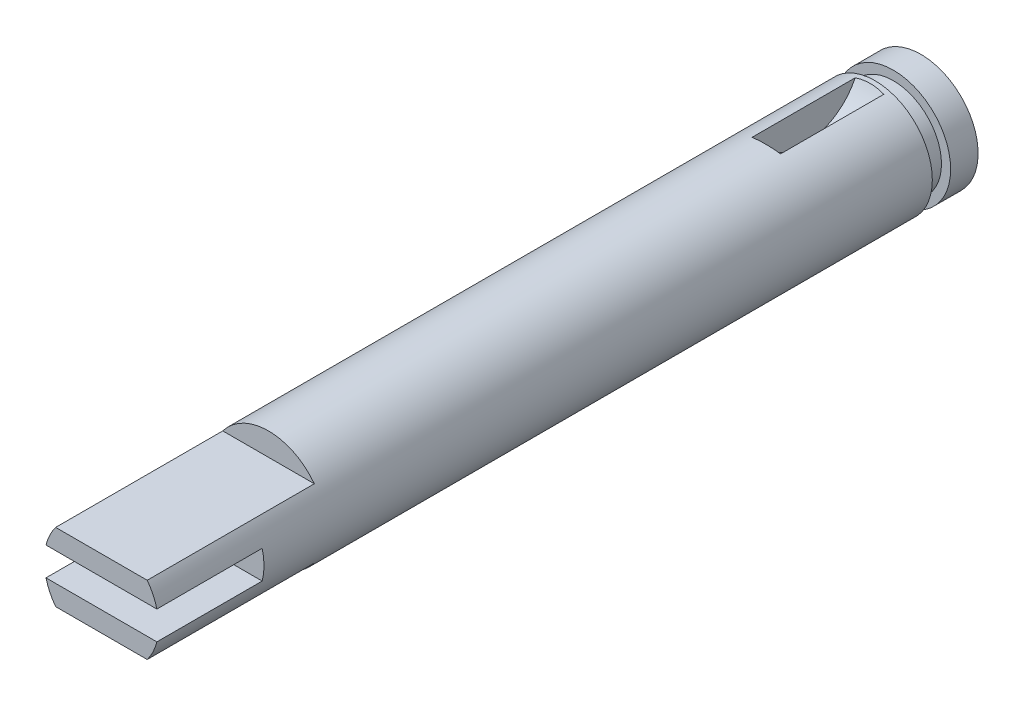
ISO-10303-21;
HEADER;
FILE_DESCRIPTION(('STEP AP214'),'2;1');
FILE_NAME('part.step','',(''),(''),'','','');
FILE_SCHEMA(('AUTOMOTIVE_DESIGN { 1 0 10303 214 1 1 1 1 }'));
ENDSEC;
DATA;
#1=APPLICATION_CONTEXT('core data for automotive mechanical design processes');
#2=APPLICATION_PROTOCOL_DEFINITION('international standard','automotive_design',2000,#1);
#3=PRODUCT_CONTEXT('',#1,'mechanical');
#4=PRODUCT('Part','Part','',(#3));
#5=PRODUCT_RELATED_PRODUCT_CATEGORY('part','',(#4));
#6=PRODUCT_DEFINITION_FORMATION('','',#4);
#7=PRODUCT_DEFINITION_CONTEXT('part definition',#1,'design');
#8=PRODUCT_DEFINITION('design','',#6,#7);
#9=PRODUCT_DEFINITION_SHAPE('','',#8);
#10=(LENGTH_UNIT() NAMED_UNIT(*) SI_UNIT(.MILLI.,.METRE.));
#11=(NAMED_UNIT(*) PLANE_ANGLE_UNIT() SI_UNIT($,.RADIAN.));
#12=(NAMED_UNIT(*) SI_UNIT($,.STERADIAN.) SOLID_ANGLE_UNIT());
#13=UNCERTAINTY_MEASURE_WITH_UNIT(LENGTH_MEASURE(1.E-05),#10,'distance_accuracy_value','');
#14=(GEOMETRIC_REPRESENTATION_CONTEXT(3) GLOBAL_UNCERTAINTY_ASSIGNED_CONTEXT((#13)) GLOBAL_UNIT_ASSIGNED_CONTEXT((#10,
#11,#12)) REPRESENTATION_CONTEXT('',''));
#15=CARTESIAN_POINT('',(0.,0.,0.));
#16=DIRECTION('',(0.,0.,1.));
#17=DIRECTION('',(1.,0.,0.));
#18=AXIS2_PLACEMENT_3D('',#15,#16,#17);
#19=CARTESIAN_POINT('',(0.,0.,42.926));
#20=DIRECTION('',(0.,0.,1.));
#21=DIRECTION('',(1.,0.,0.));
#22=AXIS2_PLACEMENT_3D('',#19,#20,#21);
#23=PLANE('',#22);
#24=CARTESIAN_POINT('',(0.,0.,42.926));
#25=DIRECTION('',(0.,0.,1.));
#26=DIRECTION('',(1.,0.,0.));
#27=AXIS2_PLACEMENT_3D('',#24,#25,#26);
#28=CIRCLE('',#27,3.175);
#29=CARTESIAN_POINT('',(-3.07581310225443,-0.7874,42.926));
#30=VERTEX_POINT('',#29);
#31=CARTESIAN_POINT('',(-2.54,-1.905,42.926));
#32=VERTEX_POINT('',#31);
#33=EDGE_CURVE('E161',#30,#32,#28,.T.);
#34=ORIENTED_EDGE('',*,*,#33,.T.);
#35=DIRECTION('',(1.,0.,0.));
#36=VECTOR('',#35,1.);
#37=CARTESIAN_POINT('',(-3.175,-1.905,42.926));
#38=LINE('',#37,#36);
#39=CARTESIAN_POINT('',(2.54,-1.905,42.926));
#40=VERTEX_POINT('',#39);
#41=EDGE_CURVE('E125',#32,#40,#38,.T.);
#42=ORIENTED_EDGE('',*,*,#41,.T.);
#43=CARTESIAN_POINT('',(3.07581310225443,-0.7874,42.926));
#44=VERTEX_POINT('',#43);
#45=EDGE_CURVE('E58',#40,#44,#28,.T.);
#46=ORIENTED_EDGE('',*,*,#45,.T.);
#47=DIRECTION('',(1.,0.,0.));
#48=VECTOR('',#47,1.);
#49=CARTESIAN_POINT('',(-3.175,-0.7874,42.926));
#50=LINE('',#49,#48);
#51=EDGE_CURVE('E133',#30,#44,#50,.T.);
#52=ORIENTED_EDGE('',*,*,#51,.F.);
#53=EDGE_LOOP('',(#34,#42,#46,#52));
#54=FACE_BOUND('',#53,.T.);
#55=ADVANCED_FACE('F34',(#54),#23,.T.);
#56=CARTESIAN_POINT('',(0.,0.,42.926));
#57=DIRECTION('',(0.,0.,-1.));
#58=DIRECTION('',(-1.,0.,0.));
#59=AXIS2_PLACEMENT_3D('',#56,#57,#58);
#60=CYLINDRICAL_SURFACE('',#59,3.175);
#61=CARTESIAN_POINT('',(0.,0.,0.));
#62=DIRECTION('',(0.,0.,1.));
#63=DIRECTION('',(1.,0.,0.));
#64=AXIS2_PLACEMENT_3D('',#61,#62,#63);
#65=CIRCLE('',#64,3.175);
#66=CARTESIAN_POINT('',(3.175,0.,0.));
#67=VERTEX_POINT('',#66);
#68=EDGE_CURVE('E149',#67,#67,#65,.T.);
#69=ORIENTED_EDGE('',*,*,#68,.T.);
#70=EDGE_LOOP('',(#69));
#71=FACE_BOUND('',#70,.T.);
#72=CARTESIAN_POINT('',(0.79375,3.07418053105214,0.31117755725787));
#73=CARTESIAN_POINT('',(0.714888608920865,3.09455662843597,0.301450554495417));
#74=CARTESIAN_POINT('',(0.63505416141262,3.11191895979803,0.293381371889491));
#75=CARTESIAN_POINT('',(0.474031104442736,3.14047497122854,0.280327929345211));
#76=CARTESIAN_POINT('',(0.392842353277951,3.15166800156809,0.275343994327388));
#77=CARTESIAN_POINT('',(0.231571379542788,3.16755748116306,0.268313017791284));
#78=CARTESIAN_POINT('',(0.151505888276026,3.17239566707134,0.266201862514545));
#79=CARTESIAN_POINT('',(-0.00875508518506204,3.17599957954489,0.264627640077035));
#80=CARTESIAN_POINT('',(-0.0889505252156203,3.17476698826052,0.265163839361458));
#81=CARTESIAN_POINT('',(-0.273819967836502,3.16491035844165,0.269480487372106));
#82=CARTESIAN_POINT('',(-0.378370536384788,3.1541121097031,0.274215701820489));
#83=CARTESIAN_POINT('',(-0.534502897532229,3.13013870504281,0.285045446695591));
#84=CARTESIAN_POINT('',(-0.586827990033408,3.12074930541512,0.289323834308464));
#85=CARTESIAN_POINT('',(-0.690818751526154,3.09938886056079,0.299223415951192));
#86=CARTESIAN_POINT('',(-0.742484433325476,3.08741786555765,0.304844583858243));
#87=CARTESIAN_POINT('',(-0.79375,3.07418053105214,0.31117755725787));
#88=B_SPLINE_CURVE_WITH_KNOTS('',3,(#72,#73,#74,#75,#76,#77,#78,#79,#80,#81,#82,#83,#84,#85,#86,
#87),.UNSPECIFIED.,.F.,.F.,(4,2,2,2,2,2,2,4),(0.,0.245998689057966,0.492023280877516,
0.732461803114019,0.972833706040775,1.28776854451322,1.44769609311939,1.60762053070593),.UNSPECIFIED.);
#89=CARTESIAN_POINT('',(0.79375,3.07418053105214,0.31117755725787));
#90=VERTEX_POINT('',#89);
#91=CARTESIAN_POINT('',(-0.79375,3.07418053105214,0.31117755725787));
#92=VERTEX_POINT('',#91);
#93=EDGE_CURVE('E173',#90,#92,#88,.T.);
#94=ORIENTED_EDGE('',*,*,#93,.F.);
#95=DIRECTION('',(0.,0.,-1.));
#96=VECTOR('',#95,1.);
#97=CARTESIAN_POINT('',(0.79375,3.07418053105214,42.926));
#98=LINE('',#97,#96);
#99=CARTESIAN_POINT('',(0.79375,3.07418053105214,6.03882244274213));
#100=VERTEX_POINT('',#99);
#101=EDGE_CURVE('E233',#90,#100,#98,.F.);
#102=ORIENTED_EDGE('',*,*,#101,.T.);
#103=CARTESIAN_POINT('',(-0.79375,3.07418053105214,6.03882244274213));
#104=CARTESIAN_POINT('',(-0.714888608920865,3.09455662843597,6.04854944550458));
#105=CARTESIAN_POINT('',(-0.63505416141262,3.11191895979803,6.05661862811051));
#106=CARTESIAN_POINT('',(-0.474031104442736,3.14047497122854,6.06967207065479));
#107=CARTESIAN_POINT('',(-0.392842353277951,3.15166800156809,6.07465600567261));
#108=CARTESIAN_POINT('',(-0.231571379542789,3.16755748116306,6.08168698220872));
#109=CARTESIAN_POINT('',(-0.151505888276026,3.17239566707134,6.08379813748545));
#110=CARTESIAN_POINT('',(0.0087550851850621,3.17599957954489,6.08537235992296));
#111=CARTESIAN_POINT('',(0.0889505252156204,3.17476698826052,6.08483616063854));
#112=CARTESIAN_POINT('',(0.273819967836502,3.16491035844165,6.08051951262789));
#113=CARTESIAN_POINT('',(0.378370536384788,3.1541121097031,6.07578429817951));
#114=CARTESIAN_POINT('',(0.534502897532229,3.13013870504281,6.06495455330441));
#115=CARTESIAN_POINT('',(0.586827990033408,3.12074930541512,6.06067616569154));
#116=CARTESIAN_POINT('',(0.690818751526154,3.09938886056079,6.05077658404881));
#117=CARTESIAN_POINT('',(0.742484433325476,3.08741786555765,6.04515541614176));
#118=CARTESIAN_POINT('',(0.79375,3.07418053105214,6.03882244274213));
#119=B_SPLINE_CURVE_WITH_KNOTS('',3,(#103,#104,#105,#106,#107,#108,#109,#110,#111,#112,#113,
#114,#115,#116,#117,#118),.UNSPECIFIED.,.F.,.F.,(4,2,2,2,2,2,2,4),(0.,0.245998689057966,
0.492023280877517,0.732461803114019,0.972833706040776,1.28776854451322,1.44769609311939,
1.60762053070593),.UNSPECIFIED.);
#120=CARTESIAN_POINT('',(-0.79375,3.07418053105214,6.03882244274213));
#121=VERTEX_POINT('',#120);
#122=EDGE_CURVE('E167',#121,#100,#119,.T.);
#123=ORIENTED_EDGE('',*,*,#122,.F.);
#124=DIRECTION('',(0.,0.,-1.));
#125=VECTOR('',#124,1.);
#126=CARTESIAN_POINT('',(-0.79375,3.07418053105214,42.926));
#127=LINE('',#126,#125);
#128=EDGE_CURVE('E165',#92,#121,#127,.F.);
#129=ORIENTED_EDGE('',*,*,#128,.F.);
#130=EDGE_LOOP('',(#94,#102,#123,#129));
#131=FACE_BOUND('',#130,.T.);
#132=DIRECTION('',(0.,0.,-1.));
#133=VECTOR('',#132,1.);
#134=CARTESIAN_POINT('',(-2.54,-1.905,42.926));
#135=LINE('',#134,#133);
#136=CARTESIAN_POINT('',(-2.54,-1.905,33.655));
#137=VERTEX_POINT('',#136);
#138=EDGE_CURVE('E12',#32,#137,#135,.T.);
#139=ORIENTED_EDGE('',*,*,#138,.F.);
#140=ORIENTED_EDGE('',*,*,#33,.F.);
#141=DIRECTION('',(0.,0.,-1.));
#142=VECTOR('',#141,1.);
#143=CARTESIAN_POINT('',(-3.07581310225443,-0.7874,42.926));
#144=LINE('',#143,#142);
#145=CARTESIAN_POINT('',(-3.07581310225443,-0.787399999999999,37.084));
#146=VERTEX_POINT('',#145);
#147=EDGE_CURVE('E220',#30,#146,#144,.T.);
#148=ORIENTED_EDGE('',*,*,#147,.T.);
#149=CARTESIAN_POINT('',(0.,0.,37.084));
#150=DIRECTION('',(0.,0.,-1.));
#151=DIRECTION('',(-1.,0.,0.));
#152=AXIS2_PLACEMENT_3D('',#149,#150,#151);
#153=CIRCLE('',#152,3.175);
#154=CARTESIAN_POINT('',(-3.07581310225443,0.787400000000001,37.084));
#155=VERTEX_POINT('',#154);
#156=EDGE_CURVE('E211',#146,#155,#153,.T.);
#157=ORIENTED_EDGE('',*,*,#156,.T.);
#158=DIRECTION('',(0.,0.,-1.));
#159=VECTOR('',#158,1.);
#160=CARTESIAN_POINT('',(-3.07581310225443,0.7874,42.926));
#161=LINE('',#160,#159);
#162=CARTESIAN_POINT('',(-3.07581310225443,0.7874,42.926));
#163=VERTEX_POINT('',#162);
#164=EDGE_CURVE('E209',#155,#163,#161,.F.);
#165=ORIENTED_EDGE('',*,*,#164,.T.);
#166=CARTESIAN_POINT('',(-2.54,1.905,42.926));
#167=VERTEX_POINT('',#166);
#168=EDGE_CURVE('E163',#167,#163,#28,.T.);
#169=ORIENTED_EDGE('',*,*,#168,.F.);
#170=DIRECTION('',(0.,0.,-1.));
#171=VECTOR('',#170,1.);
#172=CARTESIAN_POINT('',(-2.54,1.905,42.926));
#173=LINE('',#172,#171);
#174=CARTESIAN_POINT('',(-2.54,1.905,33.655));
#175=VERTEX_POINT('',#174);
#176=EDGE_CURVE('E120',#167,#175,#173,.T.);
#177=ORIENTED_EDGE('',*,*,#176,.T.);
#178=CARTESIAN_POINT('',(0.,0.,33.655));
#179=DIRECTION('',(0.,0.,-1.));
#180=DIRECTION('',(-1.,0.,0.));
#181=AXIS2_PLACEMENT_3D('',#178,#179,#180);
#182=CIRCLE('',#181,3.175);
#183=CARTESIAN_POINT('',(2.54,1.905,33.655));
#184=VERTEX_POINT('',#183);
#185=EDGE_CURVE('E217',#175,#184,#182,.T.);
#186=ORIENTED_EDGE('',*,*,#185,.T.);
#187=DIRECTION('',(0.,0.,-1.));
#188=VECTOR('',#187,1.);
#189=CARTESIAN_POINT('',(2.54,1.905,42.926));
#190=LINE('',#189,#188);
#191=CARTESIAN_POINT('',(2.54,1.905,42.926));
#192=VERTEX_POINT('',#191);
#193=EDGE_CURVE('E214',#184,#192,#190,.F.);
#194=ORIENTED_EDGE('',*,*,#193,.T.);
#195=CARTESIAN_POINT('',(3.07581310225443,0.7874,42.926));
#196=VERTEX_POINT('',#195);
#197=EDGE_CURVE('E164',#196,#192,#28,.T.);
#198=ORIENTED_EDGE('',*,*,#197,.F.);
#199=DIRECTION('',(0.,0.,-1.));
#200=VECTOR('',#199,1.);
#201=CARTESIAN_POINT('',(3.07581310225443,0.7874,42.926));
#202=LINE('',#201,#200);
#203=CARTESIAN_POINT('',(3.07581310225443,0.787400000000001,37.084));
#204=VERTEX_POINT('',#203);
#205=EDGE_CURVE('E215',#196,#204,#202,.T.);
#206=ORIENTED_EDGE('',*,*,#205,.T.);
#207=CARTESIAN_POINT('',(3.07581310225443,-0.787399999999999,37.084));
#208=VERTEX_POINT('',#207);
#209=EDGE_CURVE('E228',#204,#208,#153,.T.);
#210=ORIENTED_EDGE('',*,*,#209,.T.);
#211=DIRECTION('',(0.,0.,-1.));
#212=VECTOR('',#211,1.);
#213=CARTESIAN_POINT('',(3.07581310225443,-0.7874,42.926));
#214=LINE('',#213,#212);
#215=EDGE_CURVE('E227',#208,#44,#214,.F.);
#216=ORIENTED_EDGE('',*,*,#215,.T.);
#217=ORIENTED_EDGE('',*,*,#45,.F.);
#218=DIRECTION('',(0.,0.,-1.));
#219=VECTOR('',#218,1.);
#220=CARTESIAN_POINT('',(2.54,-1.905,42.926));
#221=LINE('',#220,#219);
#222=CARTESIAN_POINT('',(2.54,-1.905,33.655));
#223=VERTEX_POINT('',#222);
#224=EDGE_CURVE('E43',#223,#40,#221,.F.);
#225=ORIENTED_EDGE('',*,*,#224,.F.);
#226=CARTESIAN_POINT('',(0.,0.,33.655));
#227=DIRECTION('',(0.,0.,1.));
#228=DIRECTION('',(1.,0.,0.));
#229=AXIS2_PLACEMENT_3D('',#226,#227,#228);
#230=CIRCLE('',#229,3.175);
#231=EDGE_CURVE('E114',#137,#223,#230,.T.);
#232=ORIENTED_EDGE('',*,*,#231,.F.);
#233=EDGE_LOOP('',(#139,#140,#148,#157,#165,#169,#177,#186,#194,#198,#206,#210,#216,#217,#225,#232));
#234=FACE_BOUND('',#233,.T.);
#235=ADVANCED_FACE('F36',(#71,#131,#234),#60,.T.);
#236=DIRECTION('',(1.,0.,0.));
#237=VECTOR('',#236,1.);
#238=CARTESIAN_POINT('',(-3.175,1.905,42.926));
#239=LINE('',#238,#237);
#240=EDGE_CURVE('E50',#167,#192,#239,.T.);
#241=ORIENTED_EDGE('',*,*,#240,.F.);
#242=ORIENTED_EDGE('',*,*,#168,.T.);
#243=DIRECTION('',(1.,0.,0.));
#244=VECTOR('',#243,1.);
#245=CARTESIAN_POINT('',(-3.175,0.7874,42.926));
#246=LINE('',#245,#244);
#247=EDGE_CURVE('E135',#163,#196,#246,.T.);
#248=ORIENTED_EDGE('',*,*,#247,.T.);
#249=ORIENTED_EDGE('',*,*,#197,.T.);
#250=EDGE_LOOP('',(#241,#242,#248,#249));
#251=FACE_BOUND('',#250,.T.);
#252=ADVANCED_FACE('F188',(#251),#23,.T.);
#253=CARTESIAN_POINT('',(0.,0.,-2.54));
#254=DIRECTION('',(0.,0.,-1.));
#255=DIRECTION('',(-1.,0.,0.));
#256=AXIS2_PLACEMENT_3D('',#253,#254,#255);
#257=CIRCLE('',#256,3.175);
#258=CARTESIAN_POINT('',(-3.175,0.,-2.54));
#259=VERTEX_POINT('',#258);
#260=EDGE_CURVE('E152',#259,#259,#257,.T.);
#261=ORIENTED_EDGE('',*,*,#260,.F.);
#262=EDGE_LOOP('',(#261));
#263=FACE_BOUND('',#262,.T.);
#264=CARTESIAN_POINT('',(0.,0.,-1.016));
#265=DIRECTION('',(0.,0.,1.));
#266=DIRECTION('',(1.,0.,0.));
#267=AXIS2_PLACEMENT_3D('',#264,#265,#266);
#268=CIRCLE('',#267,3.175);
#269=CARTESIAN_POINT('',(3.175,0.,-1.016));
#270=VERTEX_POINT('',#269);
#271=EDGE_CURVE('E156',#270,#270,#268,.T.);
#272=ORIENTED_EDGE('',*,*,#271,.F.);
#273=EDGE_LOOP('',(#272));
#274=FACE_BOUND('',#273,.T.);
#275=ADVANCED_FACE('F193',(#263,#274),#60,.T.);
#276=CARTESIAN_POINT('',(0.,0.,-2.54));
#277=DIRECTION('',(0.,0.,-1.));
#278=DIRECTION('',(-1.,0.,0.));
#279=AXIS2_PLACEMENT_3D('',#276,#277,#278);
#280=PLANE('',#279);
#281=ORIENTED_EDGE('',*,*,#260,.T.);
#282=EDGE_LOOP('',(#281));
#283=FACE_BOUND('',#282,.T.);
#284=ADVANCED_FACE('F199',(#283),#280,.T.);
#285=CARTESIAN_POINT('',(0.,0.,-1.016));
#286=DIRECTION('',(0.,0.,1.));
#287=DIRECTION('',(1.,0.,0.));
#288=AXIS2_PLACEMENT_3D('',#285,#286,#287);
#289=PLANE('',#288);
#290=CARTESIAN_POINT('',(0.,0.,-1.016));
#291=DIRECTION('',(0.,0.,1.));
#292=DIRECTION('',(1.,0.,0.));
#293=AXIS2_PLACEMENT_3D('',#290,#291,#292);
#294=CIRCLE('',#293,2.667);
#295=CARTESIAN_POINT('',(2.667,0.,-1.016));
#296=VERTEX_POINT('',#295);
#297=EDGE_CURVE('E146',#296,#296,#294,.T.);
#298=ORIENTED_EDGE('',*,*,#297,.F.);
#299=EDGE_LOOP('',(#298));
#300=FACE_BOUND('',#299,.T.);
#301=ORIENTED_EDGE('',*,*,#271,.T.);
#302=EDGE_LOOP('',(#301));
#303=FACE_BOUND('',#302,.T.);
#304=ADVANCED_FACE('F263',(#300,#303),#289,.T.);
#305=CARTESIAN_POINT('',(0.,0.,0.));
#306=DIRECTION('',(0.,0.,1.));
#307=DIRECTION('',(1.,0.,0.));
#308=AXIS2_PLACEMENT_3D('',#305,#306,#307);
#309=PLANE('',#308);
#310=CARTESIAN_POINT('',(0.,0.,0.));
#311=DIRECTION('',(0.,0.,1.));
#312=DIRECTION('',(1.,0.,0.));
#313=AXIS2_PLACEMENT_3D('',#310,#311,#312);
#314=CIRCLE('',#313,2.667);
#315=CARTESIAN_POINT('',(2.667,0.,0.));
#316=VERTEX_POINT('',#315);
#317=EDGE_CURVE('E138',#316,#316,#314,.T.);
#318=ORIENTED_EDGE('',*,*,#317,.T.);
#319=EDGE_LOOP('',(#318));
#320=FACE_BOUND('',#319,.T.);
#321=ORIENTED_EDGE('',*,*,#68,.F.);
#322=EDGE_LOOP('',(#321));
#323=FACE_BOUND('',#322,.T.);
#324=ADVANCED_FACE('F261',(#320,#323),#309,.F.);
#325=CARTESIAN_POINT('',(0.,0.,-1.016));
#326=DIRECTION('',(0.,0.,1.));
#327=DIRECTION('',(1.,0.,0.));
#328=AXIS2_PLACEMENT_3D('',#325,#326,#327);
#329=CYLINDRICAL_SURFACE('',#328,2.667);
#330=ORIENTED_EDGE('',*,*,#297,.T.);
#331=EDGE_LOOP('',(#330));
#332=FACE_BOUND('',#331,.T.);
#333=ORIENTED_EDGE('',*,*,#317,.F.);
#334=EDGE_LOOP('',(#333));
#335=FACE_BOUND('',#334,.T.);
#336=ADVANCED_FACE('F257',(#332,#335),#329,.T.);
#337=CARTESIAN_POINT('',(-0.79375,4.445,3.175));
#338=DIRECTION('',(1.,0.,0.));
#339=DIRECTION('',(0.,0.,-1.));
#340=AXIS2_PLACEMENT_3D('',#337,#338,#339);
#341=PLANE('',#340);
#342=ORIENTED_EDGE('',*,*,#128,.T.);
#343=CARTESIAN_POINT('',(-0.79375,4.445,3.175));
#344=DIRECTION('',(1.,0.,0.));
#345=DIRECTION('',(0.,0.,-1.));
#346=AXIS2_PLACEMENT_3D('',#343,#344,#345);
#347=CIRCLE('',#346,3.175);
#348=EDGE_CURVE('E155',#121,#92,#347,.T.);
#349=ORIENTED_EDGE('',*,*,#348,.T.);
#350=EDGE_LOOP('',(#342,#349));
#351=FACE_BOUND('',#350,.T.);
#352=ADVANCED_FACE('F260',(#351),#341,.T.);
#353=CARTESIAN_POINT('',(0.79375,4.445,3.175));
#354=DIRECTION('',(1.,0.,0.));
#355=DIRECTION('',(0.,0.,-1.));
#356=AXIS2_PLACEMENT_3D('',#353,#354,#355);
#357=PLANE('',#356);
#358=CARTESIAN_POINT('',(0.79375,4.445,3.175));
#359=DIRECTION('',(1.,0.,0.));
#360=DIRECTION('',(0.,0.,-1.));
#361=AXIS2_PLACEMENT_3D('',#358,#359,#360);
#362=CIRCLE('',#361,3.175);
#363=EDGE_CURVE('E158',#100,#90,#362,.T.);
#364=ORIENTED_EDGE('',*,*,#363,.F.);
#365=ORIENTED_EDGE('',*,*,#101,.F.);
#366=EDGE_LOOP('',(#364,#365));
#367=FACE_BOUND('',#366,.T.);
#368=ADVANCED_FACE('F183',(#367),#357,.F.);
#369=CARTESIAN_POINT('',(0.79375,4.445,3.175));
#370=DIRECTION('',(-1.,0.,0.));
#371=DIRECTION('',(0.,0.,1.));
#372=AXIS2_PLACEMENT_3D('',#369,#370,#371);
#373=CYLINDRICAL_SURFACE('',#372,3.175);
#374=ORIENTED_EDGE('',*,*,#93,.T.);
#375=ORIENTED_EDGE('',*,*,#348,.F.);
#376=ORIENTED_EDGE('',*,*,#122,.T.);
#377=ORIENTED_EDGE('',*,*,#363,.T.);
#378=EDGE_LOOP('',(#374,#375,#376,#377));
#379=FACE_BOUND('',#378,.T.);
#380=ADVANCED_FACE('F178',(#379),#373,.F.);
#381=CARTESIAN_POINT('',(-3.175,0.787400000000001,37.084));
#382=DIRECTION('',(0.,1.,0.));
#383=DIRECTION('',(0.,0.,1.));
#384=AXIS2_PLACEMENT_3D('',#381,#382,#383);
#385=PLANE('',#384);
#386=ORIENTED_EDGE('',*,*,#247,.F.);
#387=ORIENTED_EDGE('',*,*,#164,.F.);
#388=DIRECTION('',(1.,0.,0.));
#389=VECTOR('',#388,1.);
#390=CARTESIAN_POINT('',(-3.175,0.787400000000001,37.084));
#391=LINE('',#390,#389);
#392=EDGE_CURVE('E139',#155,#204,#391,.T.);
#393=ORIENTED_EDGE('',*,*,#392,.T.);
#394=ORIENTED_EDGE('',*,*,#205,.F.);
#395=EDGE_LOOP('',(#386,#387,#393,#394));
#396=FACE_BOUND('',#395,.T.);
#397=ADVANCED_FACE('F182',(#396),#385,.F.);
#398=CARTESIAN_POINT('',(-3.175,0.,37.084));
#399=DIRECTION('',(0.,0.,-1.));
#400=DIRECTION('',(-1.,0.,0.));
#401=AXIS2_PLACEMENT_3D('',#398,#399,#400);
#402=PLANE('',#401);
#403=ORIENTED_EDGE('',*,*,#392,.F.);
#404=ORIENTED_EDGE('',*,*,#156,.F.);
#405=DIRECTION('',(1.,0.,0.));
#406=VECTOR('',#405,1.);
#407=CARTESIAN_POINT('',(-3.175,-0.787399999999999,37.084));
#408=LINE('',#407,#406);
#409=EDGE_CURVE('E142',#146,#208,#408,.T.);
#410=ORIENTED_EDGE('',*,*,#409,.T.);
#411=ORIENTED_EDGE('',*,*,#209,.F.);
#412=EDGE_LOOP('',(#403,#404,#410,#411));
#413=FACE_BOUND('',#412,.T.);
#414=ADVANCED_FACE('F237',(#413),#402,.F.);
#415=CARTESIAN_POINT('',(-3.175,-0.787399999999999,37.084));
#416=DIRECTION('',(0.,-1.,0.));
#417=DIRECTION('',(0.,0.,-1.));
#418=AXIS2_PLACEMENT_3D('',#415,#416,#417);
#419=PLANE('',#418);
#420=ORIENTED_EDGE('',*,*,#51,.T.);
#421=ORIENTED_EDGE('',*,*,#215,.F.);
#422=ORIENTED_EDGE('',*,*,#409,.F.);
#423=ORIENTED_EDGE('',*,*,#147,.F.);
#424=EDGE_LOOP('',(#420,#421,#422,#423));
#425=FACE_BOUND('',#424,.T.);
#426=ADVANCED_FACE('F235',(#425),#419,.F.);
#427=CARTESIAN_POINT('',(-3.175,1.905,33.655));
#428=DIRECTION('',(0.,0.,-1.));
#429=DIRECTION('',(-1.,0.,0.));
#430=AXIS2_PLACEMENT_3D('',#427,#428,#429);
#431=PLANE('',#430);
#432=DIRECTION('',(1.,0.,0.));
#433=VECTOR('',#432,1.);
#434=CARTESIAN_POINT('',(-3.175,1.905,33.655));
#435=LINE('',#434,#433);
#436=EDGE_CURVE('E130',#175,#184,#435,.T.);
#437=ORIENTED_EDGE('',*,*,#436,.T.);
#438=ORIENTED_EDGE('',*,*,#185,.F.);
#439=EDGE_LOOP('',(#437,#438));
#440=FACE_BOUND('',#439,.T.);
#441=ADVANCED_FACE('F241',(#440),#431,.F.);
#442=CARTESIAN_POINT('',(-3.175,1.905,40.005));
#443=DIRECTION('',(0.,-1.,0.));
#444=DIRECTION('',(0.,0.,-1.));
#445=AXIS2_PLACEMENT_3D('',#442,#443,#444);
#446=PLANE('',#445);
#447=ORIENTED_EDGE('',*,*,#240,.T.);
#448=ORIENTED_EDGE('',*,*,#193,.F.);
#449=ORIENTED_EDGE('',*,*,#436,.F.);
#450=ORIENTED_EDGE('',*,*,#176,.F.);
#451=EDGE_LOOP('',(#447,#448,#449,#450));
#452=FACE_BOUND('',#451,.T.);
#453=ADVANCED_FACE('F239',(#452),#446,.F.);
#454=CARTESIAN_POINT('',(-3.175,-1.905,42.926));
#455=DIRECTION('',(0.,-1.,0.));
#456=DIRECTION('',(0.,0.,-1.));
#457=AXIS2_PLACEMENT_3D('',#454,#455,#456);
#458=PLANE('',#457);
#459=ORIENTED_EDGE('',*,*,#138,.T.);
#460=DIRECTION('',(1.,0.,0.));
#461=VECTOR('',#460,1.);
#462=CARTESIAN_POINT('',(-3.175,-1.905,33.655));
#463=LINE('',#462,#461);
#464=EDGE_CURVE('E124',#137,#223,#463,.T.);
#465=ORIENTED_EDGE('',*,*,#464,.T.);
#466=ORIENTED_EDGE('',*,*,#224,.T.);
#467=ORIENTED_EDGE('',*,*,#41,.F.);
#468=EDGE_LOOP('',(#459,#465,#466,#467));
#469=FACE_BOUND('',#468,.T.);
#470=ADVANCED_FACE('F123',(#469),#458,.T.);
#471=CARTESIAN_POINT('',(-3.175,-1.905,33.655));
#472=DIRECTION('',(0.,0.,1.));
#473=DIRECTION('',(1.,0.,0.));
#474=AXIS2_PLACEMENT_3D('',#471,#472,#473);
#475=PLANE('',#474);
#476=ORIENTED_EDGE('',*,*,#464,.F.);
#477=ORIENTED_EDGE('',*,*,#231,.T.);
#478=EDGE_LOOP('',(#476,#477));
#479=FACE_BOUND('',#478,.T.);
#480=ADVANCED_FACE('F126',(#479),#475,.T.);
#481=CLOSED_SHELL('',(#55,#235,#252,#275,#284,#304,#324,#336,#352,#368,#380,#397,#414,#426,#441,
#453,#470,#480));
#482=MANIFOLD_SOLID_BREP('B2',#481);
#483=ADVANCED_BREP_SHAPE_REPRESENTATION('',(#18,#482),#14);
#484=SHAPE_DEFINITION_REPRESENTATION(#9,#483);
ENDSEC;
END-ISO-10303-21;
